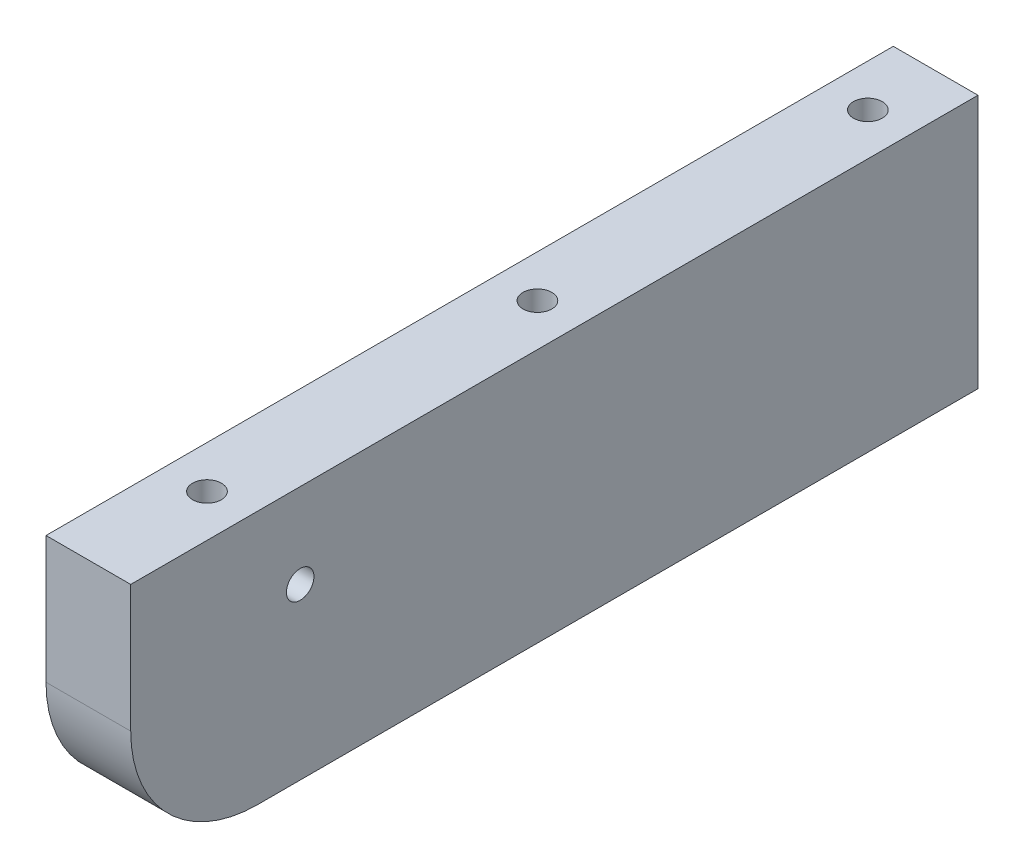
ISO-10303-21;
HEADER;
FILE_DESCRIPTION(('STEP AP214'),'2;1');
FILE_NAME('part.step','',(''),(''),'','','');
FILE_SCHEMA(('AUTOMOTIVE_DESIGN { 1 0 10303 214 1 1 1 1 }'));
ENDSEC;
DATA;
#1=APPLICATION_CONTEXT('core data for automotive mechanical design processes');
#2=APPLICATION_PROTOCOL_DEFINITION('international standard','automotive_design',2000,#1);
#3=PRODUCT_CONTEXT('',#1,'mechanical');
#4=PRODUCT('Part','Part','',(#3));
#5=PRODUCT_RELATED_PRODUCT_CATEGORY('part','',(#4));
#6=PRODUCT_DEFINITION_FORMATION('','',#4);
#7=PRODUCT_DEFINITION_CONTEXT('part definition',#1,'design');
#8=PRODUCT_DEFINITION('design','',#6,#7);
#9=PRODUCT_DEFINITION_SHAPE('','',#8);
#10=(LENGTH_UNIT() NAMED_UNIT(*) SI_UNIT(.MILLI.,.METRE.));
#11=(NAMED_UNIT(*) PLANE_ANGLE_UNIT() SI_UNIT($,.RADIAN.));
#12=(NAMED_UNIT(*) SI_UNIT($,.STERADIAN.) SOLID_ANGLE_UNIT());
#13=UNCERTAINTY_MEASURE_WITH_UNIT(LENGTH_MEASURE(1.E-05),#10,'distance_accuracy_value','');
#14=(GEOMETRIC_REPRESENTATION_CONTEXT(3) GLOBAL_UNCERTAINTY_ASSIGNED_CONTEXT((#13)) GLOBAL_UNIT_ASSIGNED_CONTEXT((#10,
#11,#12)) REPRESENTATION_CONTEXT('',''));
#15=CARTESIAN_POINT('',(0.,0.,0.));
#16=DIRECTION('',(0.,0.,1.));
#17=DIRECTION('',(1.,0.,0.));
#18=AXIS2_PLACEMENT_3D('',#15,#16,#17);
#19=CARTESIAN_POINT('',(10.,-15.,0.));
#20=DIRECTION('',(0.,1.,0.));
#21=DIRECTION('',(0.,0.,1.));
#22=AXIS2_PLACEMENT_3D('',#19,#20,#21);
#23=PLANE('',#22);
#24=DIRECTION('',(0.,0.,-1.));
#25=VECTOR('',#24,1.);
#26=CARTESIAN_POINT('',(10.,-15.,0.));
#27=LINE('',#26,#25);
#28=CARTESIAN_POINT('',(10.,-15.,35.));
#29=VERTEX_POINT('',#28);
#30=CARTESIAN_POINT('',(10.,-15.,-50.));
#31=VERTEX_POINT('',#30);
#32=EDGE_CURVE('E119',#29,#31,#27,.T.);
#33=ORIENTED_EDGE('',*,*,#32,.F.);
#34=DIRECTION('',(-1.,0.,0.));
#35=VECTOR('',#34,1.);
#36=CARTESIAN_POINT('',(0.,-15.,35.));
#37=LINE('',#36,#35);
#38=CARTESIAN_POINT('',(0.,-15.,35.));
#39=VERTEX_POINT('',#38);
#40=EDGE_CURVE('E149',#29,#39,#37,.T.);
#41=ORIENTED_EDGE('',*,*,#40,.T.);
#42=DIRECTION('',(0.,0.,-1.));
#43=VECTOR('',#42,1.);
#44=CARTESIAN_POINT('',(0.,-15.,0.));
#45=LINE('',#44,#43);
#46=CARTESIAN_POINT('',(0.,-15.,-50.));
#47=VERTEX_POINT('',#46);
#48=EDGE_CURVE('E133',#39,#47,#45,.T.);
#49=ORIENTED_EDGE('',*,*,#48,.T.);
#50=DIRECTION('',(-1.,0.,0.));
#51=VECTOR('',#50,1.);
#52=CARTESIAN_POINT('',(10.,-15.,-50.));
#53=LINE('',#52,#51);
#54=EDGE_CURVE('E146',#31,#47,#53,.T.);
#55=ORIENTED_EDGE('',*,*,#54,.F.);
#56=EDGE_LOOP('',(#33,#41,#49,#55));
#57=FACE_BOUND('',#56,.T.);
#58=ADVANCED_FACE('F41',(#57),#23,.F.);
#59=CARTESIAN_POINT('',(10.,0.,-50.));
#60=DIRECTION('',(0.,0.,1.));
#61=DIRECTION('',(1.,0.,0.));
#62=AXIS2_PLACEMENT_3D('',#59,#60,#61);
#63=PLANE('',#62);
#64=DIRECTION('',(0.,1.,0.));
#65=VECTOR('',#64,1.);
#66=CARTESIAN_POINT('',(0.,0.,-50.));
#67=LINE('',#66,#65);
#68=CARTESIAN_POINT('',(0.,15.,-50.));
#69=VERTEX_POINT('',#68);
#70=EDGE_CURVE('E135',#47,#69,#67,.T.);
#71=ORIENTED_EDGE('',*,*,#70,.T.);
#72=DIRECTION('',(-1.,0.,0.));
#73=VECTOR('',#72,1.);
#74=CARTESIAN_POINT('',(10.,15.,-50.));
#75=LINE('',#74,#73);
#76=CARTESIAN_POINT('',(10.,15.,-50.));
#77=VERTEX_POINT('',#76);
#78=EDGE_CURVE('E144',#77,#69,#75,.T.);
#79=ORIENTED_EDGE('',*,*,#78,.F.);
#80=DIRECTION('',(0.,1.,0.));
#81=VECTOR('',#80,1.);
#82=CARTESIAN_POINT('',(10.,0.,-50.));
#83=LINE('',#82,#81);
#84=EDGE_CURVE('E122',#31,#77,#83,.T.);
#85=ORIENTED_EDGE('',*,*,#84,.F.);
#86=ORIENTED_EDGE('',*,*,#54,.T.);
#87=EDGE_LOOP('',(#71,#79,#85,#86));
#88=FACE_BOUND('',#87,.T.);
#89=ADVANCED_FACE('F164',(#88),#63,.F.);
#90=CARTESIAN_POINT('',(10.,15.,0.));
#91=DIRECTION('',(0.,1.,0.));
#92=DIRECTION('',(0.,0.,1.));
#93=AXIS2_PLACEMENT_3D('',#90,#91,#92);
#94=PLANE('',#93);
#95=CARTESIAN_POINT('',(5.,15.,-42.));
#96=DIRECTION('',(0.,1.,0.));
#97=DIRECTION('',(0.,0.,1.));
#98=AXIS2_PLACEMENT_3D('',#95,#96,#97);
#99=CIRCLE('',#98,1.7);
#100=CARTESIAN_POINT('',(5.,15.,-40.3));
#101=VERTEX_POINT('',#100);
#102=EDGE_CURVE('E45',#101,#101,#99,.T.);
#103=ORIENTED_EDGE('',*,*,#102,.F.);
#104=EDGE_LOOP('',(#103));
#105=FACE_BOUND('',#104,.T.);
#106=CARTESIAN_POINT('',(5.,15.,36.));
#107=DIRECTION('',(0.,1.,0.));
#108=DIRECTION('',(0.,0.,1.));
#109=AXIS2_PLACEMENT_3D('',#106,#107,#108);
#110=CIRCLE('',#109,1.7);
#111=CARTESIAN_POINT('',(5.,15.,37.7));
#112=VERTEX_POINT('',#111);
#113=EDGE_CURVE('E111',#112,#112,#110,.T.);
#114=ORIENTED_EDGE('',*,*,#113,.F.);
#115=EDGE_LOOP('',(#114));
#116=FACE_BOUND('',#115,.T.);
#117=CARTESIAN_POINT('',(5.,15.,-2.99999999999989));
#118=DIRECTION('',(0.,1.,0.));
#119=DIRECTION('',(0.,0.,1.));
#120=AXIS2_PLACEMENT_3D('',#117,#118,#119);
#121=CIRCLE('',#120,1.7);
#122=CARTESIAN_POINT('',(5.,15.,-1.2999999999999));
#123=VERTEX_POINT('',#122);
#124=EDGE_CURVE('E115',#123,#123,#121,.T.);
#125=ORIENTED_EDGE('',*,*,#124,.F.);
#126=EDGE_LOOP('',(#125));
#127=FACE_BOUND('',#126,.T.);
#128=DIRECTION('',(0.,0.,-1.));
#129=VECTOR('',#128,1.);
#130=CARTESIAN_POINT('',(0.,15.,0.));
#131=LINE('',#130,#129);
#132=CARTESIAN_POINT('',(0.,15.,50.));
#133=VERTEX_POINT('',#132);
#134=EDGE_CURVE('E138',#133,#69,#131,.T.);
#135=ORIENTED_EDGE('',*,*,#134,.F.);
#136=DIRECTION('',(-1.,0.,0.));
#137=VECTOR('',#136,1.);
#138=CARTESIAN_POINT('',(10.,15.,50.));
#139=LINE('',#138,#137);
#140=CARTESIAN_POINT('',(10.,15.,50.));
#141=VERTEX_POINT('',#140);
#142=EDGE_CURVE('E129',#141,#133,#139,.T.);
#143=ORIENTED_EDGE('',*,*,#142,.F.);
#144=DIRECTION('',(0.,0.,-1.));
#145=VECTOR('',#144,1.);
#146=CARTESIAN_POINT('',(10.,15.,0.));
#147=LINE('',#146,#145);
#148=EDGE_CURVE('E124',#141,#77,#147,.T.);
#149=ORIENTED_EDGE('',*,*,#148,.T.);
#150=ORIENTED_EDGE('',*,*,#78,.T.);
#151=EDGE_LOOP('',(#135,#143,#149,#150));
#152=FACE_BOUND('',#151,.T.);
#153=ADVANCED_FACE('F160',(#105,#116,#127,#152),#94,.T.);
#154=CARTESIAN_POINT('',(10.,5.,30.));
#155=DIRECTION('',(-1.,0.,0.));
#156=DIRECTION('',(0.,0.,1.));
#157=AXIS2_PLACEMENT_3D('',#154,#155,#156);
#158=CYLINDRICAL_SURFACE('',#157,1.625);
#159=CARTESIAN_POINT('',(10.,5.,30.));
#160=DIRECTION('',(1.,0.,0.));
#161=DIRECTION('',(0.,0.,-1.));
#162=AXIS2_PLACEMENT_3D('',#159,#160,#161);
#163=CIRCLE('',#162,1.625);
#164=CARTESIAN_POINT('',(10.,5.,28.375));
#165=VERTEX_POINT('',#164);
#166=EDGE_CURVE('E116',#165,#165,#163,.T.);
#167=ORIENTED_EDGE('',*,*,#166,.T.);
#168=EDGE_LOOP('',(#167));
#169=FACE_BOUND('',#168,.T.);
#170=CARTESIAN_POINT('',(0.,5.,30.));
#171=DIRECTION('',(1.,0.,0.));
#172=DIRECTION('',(0.,0.,-1.));
#173=AXIS2_PLACEMENT_3D('',#170,#171,#172);
#174=CIRCLE('',#173,1.625);
#175=CARTESIAN_POINT('',(0.,5.,28.375));
#176=VERTEX_POINT('',#175);
#177=EDGE_CURVE('E130',#176,#176,#174,.T.);
#178=ORIENTED_EDGE('',*,*,#177,.F.);
#179=EDGE_LOOP('',(#178));
#180=FACE_BOUND('',#179,.T.);
#181=ADVANCED_FACE('F163',(#169,#180),#158,.F.);
#182=CARTESIAN_POINT('',(10.,0.,50.));
#183=DIRECTION('',(0.,0.,1.));
#184=DIRECTION('',(1.,0.,0.));
#185=AXIS2_PLACEMENT_3D('',#182,#183,#184);
#186=PLANE('',#185);
#187=DIRECTION('',(0.,1.,0.));
#188=VECTOR('',#187,1.);
#189=CARTESIAN_POINT('',(0.,0.,50.));
#190=LINE('',#189,#188);
#191=CARTESIAN_POINT('',(0.,0.,50.));
#192=VERTEX_POINT('',#191);
#193=EDGE_CURVE('E120',#192,#133,#190,.T.);
#194=ORIENTED_EDGE('',*,*,#193,.F.);
#195=DIRECTION('',(-1.,0.,0.));
#196=VECTOR('',#195,1.);
#197=CARTESIAN_POINT('',(10.,0.,50.));
#198=LINE('',#197,#196);
#199=CARTESIAN_POINT('',(10.,0.,50.));
#200=VERTEX_POINT('',#199);
#201=EDGE_CURVE('E50',#192,#200,#198,.F.);
#202=ORIENTED_EDGE('',*,*,#201,.T.);
#203=DIRECTION('',(0.,1.,0.));
#204=VECTOR('',#203,1.);
#205=CARTESIAN_POINT('',(10.,0.,50.));
#206=LINE('',#205,#204);
#207=EDGE_CURVE('E127',#200,#141,#206,.T.);
#208=ORIENTED_EDGE('',*,*,#207,.T.);
#209=ORIENTED_EDGE('',*,*,#142,.T.);
#210=EDGE_LOOP('',(#194,#202,#208,#209));
#211=FACE_BOUND('',#210,.T.);
#212=ADVANCED_FACE('F175',(#211),#186,.T.);
#213=CARTESIAN_POINT('',(10.,0.,0.));
#214=DIRECTION('',(1.,0.,0.));
#215=DIRECTION('',(0.,0.,-1.));
#216=AXIS2_PLACEMENT_3D('',#213,#214,#215);
#217=PLANE('',#216);
#218=ORIENTED_EDGE('',*,*,#166,.F.);
#219=EDGE_LOOP('',(#218));
#220=FACE_BOUND('',#219,.T.);
#221=ORIENTED_EDGE('',*,*,#207,.F.);
#222=CARTESIAN_POINT('',(10.,0.,35.));
#223=DIRECTION('',(1.,0.,0.));
#224=DIRECTION('',(0.,0.,-1.));
#225=AXIS2_PLACEMENT_3D('',#222,#223,#224);
#226=CIRCLE('',#225,15.);
#227=EDGE_CURVE('E11',#200,#29,#226,.T.);
#228=ORIENTED_EDGE('',*,*,#227,.T.);
#229=ORIENTED_EDGE('',*,*,#32,.T.);
#230=ORIENTED_EDGE('',*,*,#84,.T.);
#231=ORIENTED_EDGE('',*,*,#148,.F.);
#232=EDGE_LOOP('',(#221,#228,#229,#230,#231));
#233=FACE_BOUND('',#232,.T.);
#234=ADVANCED_FACE('F178',(#220,#233),#217,.T.);
#235=CARTESIAN_POINT('',(0.,0.,0.));
#236=DIRECTION('',(1.,0.,0.));
#237=DIRECTION('',(0.,0.,-1.));
#238=AXIS2_PLACEMENT_3D('',#235,#236,#237);
#239=PLANE('',#238);
#240=ORIENTED_EDGE('',*,*,#177,.T.);
#241=EDGE_LOOP('',(#240));
#242=FACE_BOUND('',#241,.T.);
#243=ORIENTED_EDGE('',*,*,#48,.F.);
#244=CARTESIAN_POINT('',(0.,0.,35.));
#245=DIRECTION('',(1.,0.,0.));
#246=DIRECTION('',(0.,0.,-1.));
#247=AXIS2_PLACEMENT_3D('',#244,#245,#246);
#248=CIRCLE('',#247,15.);
#249=EDGE_CURVE('E65',#39,#192,#248,.F.);
#250=ORIENTED_EDGE('',*,*,#249,.T.);
#251=ORIENTED_EDGE('',*,*,#193,.T.);
#252=ORIENTED_EDGE('',*,*,#134,.T.);
#253=ORIENTED_EDGE('',*,*,#70,.F.);
#254=EDGE_LOOP('',(#243,#250,#251,#252,#253));
#255=FACE_BOUND('',#254,.T.);
#256=ADVANCED_FACE('F174',(#242,#255),#239,.F.);
#257=CARTESIAN_POINT('',(10.,0.,35.));
#258=DIRECTION('',(1.,0.,0.));
#259=DIRECTION('',(0.,0.,-1.));
#260=AXIS2_PLACEMENT_3D('',#257,#258,#259);
#261=CYLINDRICAL_SURFACE('',#260,15.);
#262=ORIENTED_EDGE('',*,*,#227,.F.);
#263=ORIENTED_EDGE('',*,*,#201,.F.);
#264=ORIENTED_EDGE('',*,*,#249,.F.);
#265=ORIENTED_EDGE('',*,*,#40,.F.);
#266=EDGE_LOOP('',(#262,#263,#264,#265));
#267=FACE_BOUND('',#266,.T.);
#268=ADVANCED_FACE('F43',(#267),#261,.T.);
#269=CARTESIAN_POINT('',(5.,2.00000000000002,-2.99999999999989));
#270=DIRECTION('',(0.,1.,0.));
#271=DIRECTION('',(0.,0.,1.));
#272=AXIS2_PLACEMENT_3D('',#269,#270,#271);
#273=CONICAL_SURFACE('',#272,1.69999999999999,1.02974425867665);
#274=CARTESIAN_POINT('',(5.,0.97853694765317,-2.99999999999989));
#275=VERTEX_POINT('',#274);
#276=VERTEX_LOOP('',#275);
#277=FACE_BOUND('',#276,.T.);
#278=CARTESIAN_POINT('',(5.,2.00000000000002,-2.99999999999989));
#279=DIRECTION('',(0.,1.,0.));
#280=DIRECTION('',(0.,0.,1.));
#281=AXIS2_PLACEMENT_3D('',#278,#279,#280);
#282=CIRCLE('',#281,1.69999999999999);
#283=CARTESIAN_POINT('',(5.,2.00000000000002,-1.2999999999999));
#284=VERTEX_POINT('',#283);
#285=EDGE_CURVE('E112',#284,#284,#282,.T.);
#286=ORIENTED_EDGE('',*,*,#285,.T.);
#287=EDGE_LOOP('',(#286));
#288=FACE_BOUND('',#287,.T.);
#289=ADVANCED_FACE('F208',(#277,#288),#273,.F.);
#290=CARTESIAN_POINT('',(5.,25.,-2.99999999999989));
#291=DIRECTION('',(0.,1.,0.));
#292=DIRECTION('',(0.,0.,1.));
#293=AXIS2_PLACEMENT_3D('',#290,#291,#292);
#294=CYLINDRICAL_SURFACE('',#293,1.7);
#295=ORIENTED_EDGE('',*,*,#124,.T.);
#296=EDGE_LOOP('',(#295));
#297=FACE_BOUND('',#296,.T.);
#298=ORIENTED_EDGE('',*,*,#285,.F.);
#299=EDGE_LOOP('',(#298));
#300=FACE_BOUND('',#299,.T.);
#301=ADVANCED_FACE('F214',(#297,#300),#294,.F.);
#302=CARTESIAN_POINT('',(5.,2.00000000000002,36.));
#303=DIRECTION('',(0.,1.,0.));
#304=DIRECTION('',(0.,0.,1.));
#305=AXIS2_PLACEMENT_3D('',#302,#303,#304);
#306=CONICAL_SURFACE('',#305,1.69999999999999,1.02974425867665);
#307=CARTESIAN_POINT('',(5.,0.97853694765317,36.));
#308=VERTEX_POINT('',#307);
#309=VERTEX_LOOP('',#308);
#310=FACE_BOUND('',#309,.T.);
#311=CARTESIAN_POINT('',(5.,2.00000000000002,36.));
#312=DIRECTION('',(0.,1.,0.));
#313=DIRECTION('',(0.,0.,1.));
#314=AXIS2_PLACEMENT_3D('',#311,#312,#313);
#315=CIRCLE('',#314,1.69999999999999);
#316=CARTESIAN_POINT('',(5.,2.00000000000002,37.7));
#317=VERTEX_POINT('',#316);
#318=EDGE_CURVE('E107',#317,#317,#315,.T.);
#319=ORIENTED_EDGE('',*,*,#318,.T.);
#320=EDGE_LOOP('',(#319));
#321=FACE_BOUND('',#320,.T.);
#322=ADVANCED_FACE('F218',(#310,#321),#306,.F.);
#323=CARTESIAN_POINT('',(5.,25.,36.));
#324=DIRECTION('',(0.,1.,0.));
#325=DIRECTION('',(0.,0.,1.));
#326=AXIS2_PLACEMENT_3D('',#323,#324,#325);
#327=CYLINDRICAL_SURFACE('',#326,1.7);
#328=ORIENTED_EDGE('',*,*,#113,.T.);
#329=EDGE_LOOP('',(#328));
#330=FACE_BOUND('',#329,.T.);
#331=ORIENTED_EDGE('',*,*,#318,.F.);
#332=EDGE_LOOP('',(#331));
#333=FACE_BOUND('',#332,.T.);
#334=ADVANCED_FACE('F99',(#330,#333),#327,.F.);
#335=CARTESIAN_POINT('',(5.,2.00000000000002,-42.));
#336=DIRECTION('',(0.,1.,0.));
#337=DIRECTION('',(0.,0.,1.));
#338=AXIS2_PLACEMENT_3D('',#335,#336,#337);
#339=CONICAL_SURFACE('',#338,1.69999999999999,1.02974425867665);
#340=CARTESIAN_POINT('',(5.,0.97853694765317,-42.));
#341=VERTEX_POINT('',#340);
#342=VERTEX_LOOP('',#341);
#343=FACE_BOUND('',#342,.T.);
#344=CARTESIAN_POINT('',(5.,2.00000000000002,-42.));
#345=DIRECTION('',(0.,1.,0.));
#346=DIRECTION('',(0.,0.,1.));
#347=AXIS2_PLACEMENT_3D('',#344,#345,#346);
#348=CIRCLE('',#347,1.69999999999999);
#349=CARTESIAN_POINT('',(5.,2.00000000000002,-40.3));
#350=VERTEX_POINT('',#349);
#351=EDGE_CURVE('E103',#350,#350,#348,.T.);
#352=ORIENTED_EDGE('',*,*,#351,.T.);
#353=EDGE_LOOP('',(#352));
#354=FACE_BOUND('',#353,.T.);
#355=ADVANCED_FACE('F95',(#343,#354),#339,.F.);
#356=CARTESIAN_POINT('',(5.,25.,-42.));
#357=DIRECTION('',(0.,1.,0.));
#358=DIRECTION('',(0.,0.,1.));
#359=AXIS2_PLACEMENT_3D('',#356,#357,#358);
#360=CYLINDRICAL_SURFACE('',#359,1.7);
#361=ORIENTED_EDGE('',*,*,#102,.T.);
#362=EDGE_LOOP('',(#361));
#363=FACE_BOUND('',#362,.T.);
#364=ORIENTED_EDGE('',*,*,#351,.F.);
#365=EDGE_LOOP('',(#364));
#366=FACE_BOUND('',#365,.T.);
#367=ADVANCED_FACE('F98',(#363,#366),#360,.F.);
#368=CLOSED_SHELL('',(#58,#89,#153,#181,#212,#234,#256,#268,#289,#301,#322,#334,#355,#367));
#369=MANIFOLD_SOLID_BREP('B2',#368);
#370=ADVANCED_BREP_SHAPE_REPRESENTATION('',(#18,#369),#14);
#371=SHAPE_DEFINITION_REPRESENTATION(#9,#370);
ENDSEC;
END-ISO-10303-21;
